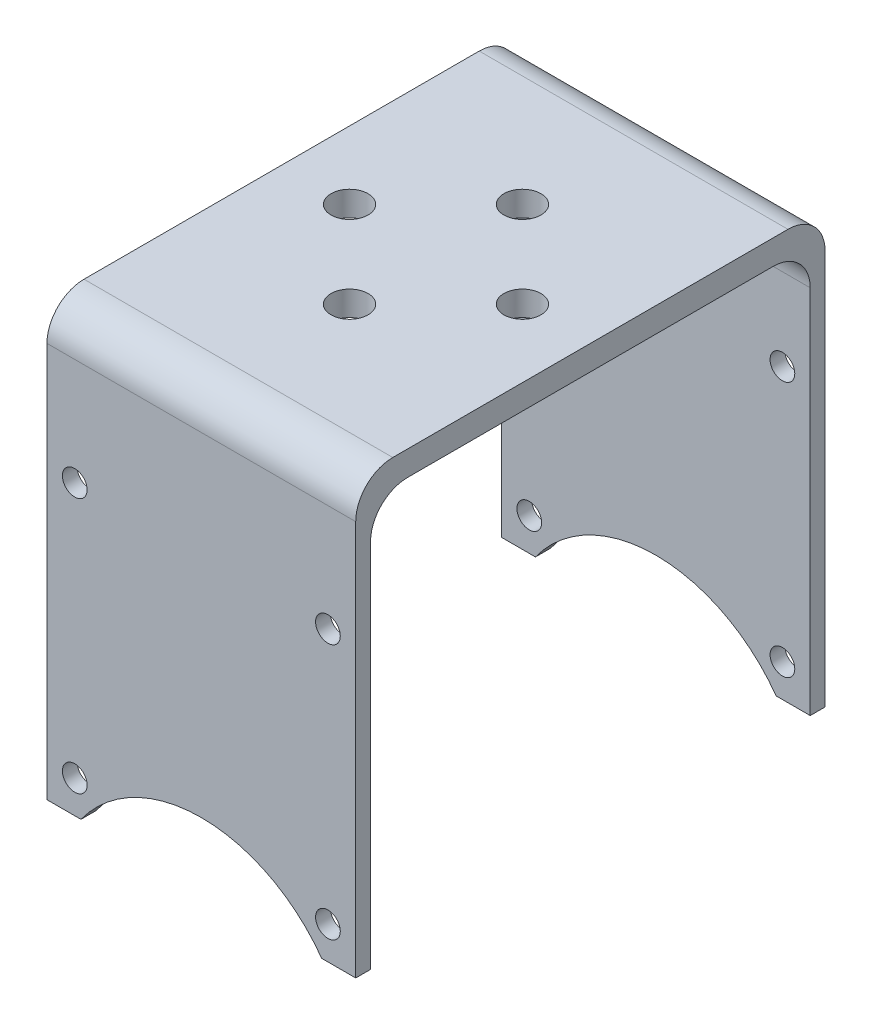
ISO-10303-21;
HEADER;
FILE_DESCRIPTION(('STEP AP214'),'2;1');
FILE_NAME('part.step','',(''),(''),'','','');
FILE_SCHEMA(('AUTOMOTIVE_DESIGN { 1 0 10303 214 1 1 1 1 }'));
ENDSEC;
DATA;
#1=APPLICATION_CONTEXT('core data for automotive mechanical design processes');
#2=APPLICATION_PROTOCOL_DEFINITION('international standard','automotive_design',2000,#1);
#3=PRODUCT_CONTEXT('',#1,'mechanical');
#4=PRODUCT('Part','Part','',(#3));
#5=PRODUCT_RELATED_PRODUCT_CATEGORY('part','',(#4));
#6=PRODUCT_DEFINITION_FORMATION('','',#4);
#7=PRODUCT_DEFINITION_CONTEXT('part definition',#1,'design');
#8=PRODUCT_DEFINITION('design','',#6,#7);
#9=PRODUCT_DEFINITION_SHAPE('','',#8);
#10=(LENGTH_UNIT() NAMED_UNIT(*) SI_UNIT(.MILLI.,.METRE.));
#11=(NAMED_UNIT(*) PLANE_ANGLE_UNIT() SI_UNIT($,.RADIAN.));
#12=(NAMED_UNIT(*) SI_UNIT($,.STERADIAN.) SOLID_ANGLE_UNIT());
#13=UNCERTAINTY_MEASURE_WITH_UNIT(LENGTH_MEASURE(1.E-05),#10,'distance_accuracy_value','');
#14=(GEOMETRIC_REPRESENTATION_CONTEXT(3) GLOBAL_UNCERTAINTY_ASSIGNED_CONTEXT((#13)) GLOBAL_UNIT_ASSIGNED_CONTEXT((#10,
#11,#12)) REPRESENTATION_CONTEXT('',''));
#15=CARTESIAN_POINT('',(0.,0.,0.));
#16=DIRECTION('',(0.,0.,1.));
#17=DIRECTION('',(1.,0.,0.));
#18=AXIS2_PLACEMENT_3D('',#15,#16,#17);
#19=CARTESIAN_POINT('',(0.,0.,0.));
#20=DIRECTION('',(0.,-1.,0.));
#21=DIRECTION('',(0.,0.,-1.));
#22=AXIS2_PLACEMENT_3D('',#19,#20,#21);
#23=PLANE('',#22);
#24=CARTESIAN_POINT('',(0.,0.,7.));
#25=DIRECTION('',(0.,-1.,0.));
#26=DIRECTION('',(0.,0.,-1.));
#27=AXIS2_PLACEMENT_3D('',#24,#25,#26);
#28=CIRCLE('',#27,1.5);
#29=CARTESIAN_POINT('',(0.,0.,5.5));
#30=VERTEX_POINT('',#29);
#31=EDGE_CURVE('E376',#30,#30,#28,.T.);
#32=ORIENTED_EDGE('',*,*,#31,.F.);
#33=EDGE_LOOP('',(#32));
#34=FACE_BOUND('',#33,.T.);
#35=CARTESIAN_POINT('',(-7.,0.,0.));
#36=DIRECTION('',(0.,-1.,0.));
#37=DIRECTION('',(0.,0.,-1.));
#38=AXIS2_PLACEMENT_3D('',#35,#36,#37);
#39=CIRCLE('',#38,1.5);
#40=CARTESIAN_POINT('',(-7.,0.,-1.50000000000002));
#41=VERTEX_POINT('',#40);
#42=EDGE_CURVE('E398',#41,#41,#39,.T.);
#43=ORIENTED_EDGE('',*,*,#42,.F.);
#44=EDGE_LOOP('',(#43));
#45=FACE_BOUND('',#44,.T.);
#46=CARTESIAN_POINT('',(0.,0.,-7.));
#47=DIRECTION('',(0.,-1.,0.));
#48=DIRECTION('',(0.,0.,-1.));
#49=AXIS2_PLACEMENT_3D('',#46,#47,#48);
#50=CIRCLE('',#49,1.5);
#51=CARTESIAN_POINT('',(0.,0.,-8.5));
#52=VERTEX_POINT('',#51);
#53=EDGE_CURVE('E402',#52,#52,#50,.T.);
#54=ORIENTED_EDGE('',*,*,#53,.F.);
#55=EDGE_LOOP('',(#54));
#56=FACE_BOUND('',#55,.T.);
#57=CARTESIAN_POINT('',(7.,0.,0.));
#58=DIRECTION('',(0.,-1.,0.));
#59=DIRECTION('',(0.,0.,-1.));
#60=AXIS2_PLACEMENT_3D('',#57,#58,#59);
#61=CIRCLE('',#60,1.5);
#62=CARTESIAN_POINT('',(7.,0.,-1.49999999999993));
#63=VERTEX_POINT('',#62);
#64=EDGE_CURVE('E406',#63,#63,#61,.T.);
#65=ORIENTED_EDGE('',*,*,#64,.F.);
#66=EDGE_LOOP('',(#65));
#67=FACE_BOUND('',#66,.T.);
#68=DIRECTION('',(0.,0.,1.));
#69=VECTOR('',#68,1.);
#70=CARTESIAN_POINT('',(-12.5,0.,10.));
#71=LINE('',#70,#69);
#72=CARTESIAN_POINT('',(-12.5,0.,-14.8));
#73=VERTEX_POINT('',#72);
#74=CARTESIAN_POINT('',(-12.5,0.,14.8));
#75=VERTEX_POINT('',#74);
#76=EDGE_CURVE('E259',#73,#75,#71,.T.);
#77=ORIENTED_EDGE('',*,*,#76,.F.);
#78=DIRECTION('',(-1.,0.,0.));
#79=VECTOR('',#78,1.);
#80=CARTESIAN_POINT('',(0.,0.,-14.8));
#81=LINE('',#80,#79);
#82=CARTESIAN_POINT('',(12.5,0.,-14.8));
#83=VERTEX_POINT('',#82);
#84=EDGE_CURVE('E283',#73,#83,#81,.F.);
#85=ORIENTED_EDGE('',*,*,#84,.T.);
#86=DIRECTION('',(0.,0.,-1.));
#87=VECTOR('',#86,1.);
#88=CARTESIAN_POINT('',(12.5,0.,-19.));
#89=LINE('',#88,#87);
#90=CARTESIAN_POINT('',(12.5,0.,14.8));
#91=VERTEX_POINT('',#90);
#92=EDGE_CURVE('E253',#91,#83,#89,.T.);
#93=ORIENTED_EDGE('',*,*,#92,.F.);
#94=DIRECTION('',(1.,0.,0.));
#95=VECTOR('',#94,1.);
#96=CARTESIAN_POINT('',(0.,0.,14.8));
#97=LINE('',#96,#95);
#98=EDGE_CURVE('E280',#91,#75,#97,.F.);
#99=ORIENTED_EDGE('',*,*,#98,.T.);
#100=EDGE_LOOP('',(#77,#85,#93,#99));
#101=FACE_BOUND('',#100,.T.);
#102=ADVANCED_FACE('F40',(#34,#45,#56,#67,#101),#23,.T.);
#103=CARTESIAN_POINT('',(0.,2.,0.));
#104=DIRECTION('',(0.,-1.,0.));
#105=DIRECTION('',(0.,0.,-1.));
#106=AXIS2_PLACEMENT_3D('',#103,#104,#105);
#107=PLANE('',#106);
#108=CARTESIAN_POINT('',(0.,2.,7.));
#109=DIRECTION('',(0.,1.,0.));
#110=DIRECTION('',(0.,0.,1.));
#111=AXIS2_PLACEMENT_3D('',#108,#109,#110);
#112=CIRCLE('',#111,1.5);
#113=CARTESIAN_POINT('',(0.,2.,8.5));
#114=VERTEX_POINT('',#113);
#115=EDGE_CURVE('E410',#114,#114,#112,.T.);
#116=ORIENTED_EDGE('',*,*,#115,.F.);
#117=EDGE_LOOP('',(#116));
#118=FACE_BOUND('',#117,.T.);
#119=CARTESIAN_POINT('',(-7.,2.,0.));
#120=DIRECTION('',(0.,1.,0.));
#121=DIRECTION('',(0.,0.,1.));
#122=AXIS2_PLACEMENT_3D('',#119,#120,#121);
#123=CIRCLE('',#122,1.5);
#124=CARTESIAN_POINT('',(-7.,2.,1.49999999999998));
#125=VERTEX_POINT('',#124);
#126=EDGE_CURVE('E419',#125,#125,#123,.T.);
#127=ORIENTED_EDGE('',*,*,#126,.F.);
#128=EDGE_LOOP('',(#127));
#129=FACE_BOUND('',#128,.T.);
#130=CARTESIAN_POINT('',(0.,2.,-7.));
#131=DIRECTION('',(0.,1.,0.));
#132=DIRECTION('',(0.,0.,1.));
#133=AXIS2_PLACEMENT_3D('',#130,#131,#132);
#134=CIRCLE('',#133,1.5);
#135=CARTESIAN_POINT('',(0.,2.,-5.5));
#136=VERTEX_POINT('',#135);
#137=EDGE_CURVE('E415',#136,#136,#134,.T.);
#138=ORIENTED_EDGE('',*,*,#137,.F.);
#139=EDGE_LOOP('',(#138));
#140=FACE_BOUND('',#139,.T.);
#141=CARTESIAN_POINT('',(7.,2.,0.));
#142=DIRECTION('',(0.,1.,0.));
#143=DIRECTION('',(0.,0.,1.));
#144=AXIS2_PLACEMENT_3D('',#141,#142,#143);
#145=CIRCLE('',#144,1.5);
#146=CARTESIAN_POINT('',(7.,2.,1.50000000000007));
#147=VERTEX_POINT('',#146);
#148=EDGE_CURVE('E411',#147,#147,#145,.T.);
#149=ORIENTED_EDGE('',*,*,#148,.F.);
#150=EDGE_LOOP('',(#149));
#151=FACE_BOUND('',#150,.T.);
#152=DIRECTION('',(-1.,0.,0.));
#153=VECTOR('',#152,1.);
#154=CARTESIAN_POINT('',(0.,2.,-16.));
#155=LINE('',#154,#153);
#156=CARTESIAN_POINT('',(12.5,2.,-16.));
#157=VERTEX_POINT('',#156);
#158=CARTESIAN_POINT('',(-12.5,2.,-16.));
#159=VERTEX_POINT('',#158);
#160=EDGE_CURVE('E290',#157,#159,#155,.T.);
#161=ORIENTED_EDGE('',*,*,#160,.T.);
#162=DIRECTION('',(0.,0.,1.));
#163=VECTOR('',#162,1.);
#164=CARTESIAN_POINT('',(-12.5,2.,10.));
#165=LINE('',#164,#163);
#166=CARTESIAN_POINT('',(-12.5,2.,16.));
#167=VERTEX_POINT('',#166);
#168=EDGE_CURVE('E258',#159,#167,#165,.T.);
#169=ORIENTED_EDGE('',*,*,#168,.T.);
#170=DIRECTION('',(1.,0.,0.));
#171=VECTOR('',#170,1.);
#172=CARTESIAN_POINT('',(0.,2.,16.));
#173=LINE('',#172,#171);
#174=CARTESIAN_POINT('',(12.5,2.,16.));
#175=VERTEX_POINT('',#174);
#176=EDGE_CURVE('E286',#167,#175,#173,.T.);
#177=ORIENTED_EDGE('',*,*,#176,.T.);
#178=DIRECTION('',(0.,0.,-1.));
#179=VECTOR('',#178,1.);
#180=CARTESIAN_POINT('',(12.5,2.,-19.));
#181=LINE('',#180,#179);
#182=EDGE_CURVE('E254',#175,#157,#181,.T.);
#183=ORIENTED_EDGE('',*,*,#182,.T.);
#184=EDGE_LOOP('',(#161,#169,#177,#183));
#185=FACE_BOUND('',#184,.T.);
#186=ADVANCED_FACE('F429',(#118,#129,#140,#151,#185),#107,.F.);
#187=CARTESIAN_POINT('',(-12.5,2.,-19.));
#188=DIRECTION('',(0.,0.,1.));
#189=DIRECTION('',(1.,0.,0.));
#190=AXIS2_PLACEMENT_3D('',#187,#188,#189);
#191=PLANE('',#190);
#192=DIRECTION('',(0.,-1.,0.));
#193=VECTOR('',#192,1.);
#194=CARTESIAN_POINT('',(12.5,2.,-19.));
#195=LINE('',#194,#193);
#196=CARTESIAN_POINT('',(12.5,-1.,-19.));
#197=VERTEX_POINT('',#196);
#198=CARTESIAN_POINT('',(12.5,-33.,-19.));
#199=VERTEX_POINT('',#198);
#200=EDGE_CURVE('E156',#197,#199,#195,.T.);
#201=ORIENTED_EDGE('',*,*,#200,.T.);
#202=DIRECTION('',(-1.,0.,0.));
#203=VECTOR('',#202,1.);
#204=CARTESIAN_POINT('',(9.74679434480896,-33.,-19.));
#205=LINE('',#204,#203);
#206=CARTESIAN_POINT('',(9.74679434480896,-33.,-19.));
#207=VERTEX_POINT('',#206);
#208=EDGE_CURVE('E160',#199,#207,#205,.T.);
#209=ORIENTED_EDGE('',*,*,#208,.T.);
#210=CARTESIAN_POINT('',(0.,-40.,-19.));
#211=DIRECTION('',(0.,0.,1.));
#212=DIRECTION('',(-1.,0.,0.));
#213=AXIS2_PLACEMENT_3D('',#210,#211,#212);
#214=CIRCLE('',#213,12.);
#215=CARTESIAN_POINT('',(-9.74679434480896,-33.,-19.));
#216=VERTEX_POINT('',#215);
#217=EDGE_CURVE('E175',#207,#216,#214,.T.);
#218=ORIENTED_EDGE('',*,*,#217,.T.);
#219=DIRECTION('',(-1.,0.,0.));
#220=VECTOR('',#219,1.);
#221=CARTESIAN_POINT('',(-12.5,-33.,-19.));
#222=LINE('',#221,#220);
#223=CARTESIAN_POINT('',(-12.5,-33.,-19.));
#224=VERTEX_POINT('',#223);
#225=EDGE_CURVE('E189',#216,#224,#222,.T.);
#226=ORIENTED_EDGE('',*,*,#225,.T.);
#227=DIRECTION('',(0.,-1.,0.));
#228=VECTOR('',#227,1.);
#229=CARTESIAN_POINT('',(-12.5,2.,-19.));
#230=LINE('',#229,#228);
#231=CARTESIAN_POINT('',(-12.5,-1.,-19.));
#232=VERTEX_POINT('',#231);
#233=EDGE_CURVE('E168',#232,#224,#230,.T.);
#234=ORIENTED_EDGE('',*,*,#233,.F.);
#235=DIRECTION('',(-1.,0.,0.));
#236=VECTOR('',#235,1.);
#237=CARTESIAN_POINT('',(-12.5,-1.,-19.));
#238=LINE('',#237,#236);
#239=EDGE_CURVE('E163',#232,#197,#238,.F.);
#240=ORIENTED_EDGE('',*,*,#239,.T.);
#241=EDGE_LOOP('',(#201,#209,#218,#226,#234,#240));
#242=FACE_BOUND('',#241,.T.);
#243=CARTESIAN_POINT('',(-10.25,-30.35,-19.));
#244=DIRECTION('',(0.,0.,1.));
#245=DIRECTION('',(1.,0.,0.));
#246=AXIS2_PLACEMENT_3D('',#243,#244,#245);
#247=CIRCLE('',#246,1.);
#248=CARTESIAN_POINT('',(-9.25,-30.35,-19.));
#249=VERTEX_POINT('',#248);
#250=EDGE_CURVE('E202',#249,#249,#247,.T.);
#251=ORIENTED_EDGE('',*,*,#250,.T.);
#252=EDGE_LOOP('',(#251));
#253=FACE_BOUND('',#252,.T.);
#254=CARTESIAN_POINT('',(-10.25,-9.65,-19.));
#255=DIRECTION('',(0.,0.,1.));
#256=DIRECTION('',(1.,0.,0.));
#257=AXIS2_PLACEMENT_3D('',#254,#255,#256);
#258=CIRCLE('',#257,1.);
#259=CARTESIAN_POINT('',(-9.25,-9.65,-19.));
#260=VERTEX_POINT('',#259);
#261=EDGE_CURVE('E211',#260,#260,#258,.T.);
#262=ORIENTED_EDGE('',*,*,#261,.T.);
#263=EDGE_LOOP('',(#262));
#264=FACE_BOUND('',#263,.T.);
#265=CARTESIAN_POINT('',(10.25,-9.65,-19.));
#266=DIRECTION('',(0.,0.,1.));
#267=DIRECTION('',(1.,0.,0.));
#268=AXIS2_PLACEMENT_3D('',#265,#266,#267);
#269=CIRCLE('',#268,1.);
#270=CARTESIAN_POINT('',(11.25,-9.65,-19.));
#271=VERTEX_POINT('',#270);
#272=EDGE_CURVE('E384',#271,#271,#269,.T.);
#273=ORIENTED_EDGE('',*,*,#272,.T.);
#274=EDGE_LOOP('',(#273));
#275=FACE_BOUND('',#274,.T.);
#276=CARTESIAN_POINT('',(10.25,-30.35,-19.));
#277=DIRECTION('',(0.,0.,1.));
#278=DIRECTION('',(1.,0.,0.));
#279=AXIS2_PLACEMENT_3D('',#276,#277,#278);
#280=CIRCLE('',#279,1.);
#281=CARTESIAN_POINT('',(11.25,-30.35,-19.));
#282=VERTEX_POINT('',#281);
#283=EDGE_CURVE('E192',#282,#282,#280,.T.);
#284=ORIENTED_EDGE('',*,*,#283,.T.);
#285=EDGE_LOOP('',(#284));
#286=FACE_BOUND('',#285,.T.);
#287=ADVANCED_FACE('F157',(#242,#253,#264,#275,#286),#191,.F.);
#288=CARTESIAN_POINT('',(-12.5,2.,10.));
#289=DIRECTION('',(1.,0.,0.));
#290=DIRECTION('',(0.,0.,-1.));
#291=AXIS2_PLACEMENT_3D('',#288,#289,#290);
#292=PLANE('',#291);
#293=CARTESIAN_POINT('',(-12.5,-3.,14.8));
#294=DIRECTION('',(1.,0.,0.));
#295=DIRECTION('',(0.,0.,-1.));
#296=AXIS2_PLACEMENT_3D('',#293,#294,#295);
#297=CIRCLE('',#296,3.);
#298=CARTESIAN_POINT('',(-12.5,-3.,17.8));
#299=VERTEX_POINT('',#298);
#300=EDGE_CURVE('E326',#75,#299,#297,.T.);
#301=ORIENTED_EDGE('',*,*,#300,.T.);
#302=DIRECTION('',(0.,1.,0.));
#303=VECTOR('',#302,1.);
#304=CARTESIAN_POINT('',(-12.5,-40.,17.8));
#305=LINE('',#304,#303);
#306=CARTESIAN_POINT('',(-12.5,-33.,17.8));
#307=VERTEX_POINT('',#306);
#308=EDGE_CURVE('E250',#307,#299,#305,.T.);
#309=ORIENTED_EDGE('',*,*,#308,.F.);
#310=DIRECTION('',(0.,0.,1.));
#311=VECTOR('',#310,1.);
#312=CARTESIAN_POINT('',(-12.5,-33.,-19.));
#313=LINE('',#312,#311);
#314=CARTESIAN_POINT('',(-12.5,-33.,19.));
#315=VERTEX_POINT('',#314);
#316=EDGE_CURVE('E358',#307,#315,#313,.T.);
#317=ORIENTED_EDGE('',*,*,#316,.T.);
#318=DIRECTION('',(0.,-1.,0.));
#319=VECTOR('',#318,1.);
#320=CARTESIAN_POINT('',(-12.5,2.,19.));
#321=LINE('',#320,#319);
#322=CARTESIAN_POINT('',(-12.5,-1.,19.));
#323=VERTEX_POINT('',#322);
#324=EDGE_CURVE('E272',#323,#315,#321,.T.);
#325=ORIENTED_EDGE('',*,*,#324,.F.);
#326=CARTESIAN_POINT('',(-12.5,-1.,16.));
#327=DIRECTION('',(1.,0.,0.));
#328=DIRECTION('',(0.,0.,-1.));
#329=AXIS2_PLACEMENT_3D('',#326,#327,#328);
#330=CIRCLE('',#329,3.);
#331=EDGE_CURVE('E308',#323,#167,#330,.F.);
#332=ORIENTED_EDGE('',*,*,#331,.T.);
#333=ORIENTED_EDGE('',*,*,#168,.F.);
#334=CARTESIAN_POINT('',(-12.5,-1.,-16.));
#335=DIRECTION('',(1.,0.,0.));
#336=DIRECTION('',(0.,0.,-1.));
#337=AXIS2_PLACEMENT_3D('',#334,#335,#336);
#338=CIRCLE('',#337,3.);
#339=EDGE_CURVE('E294',#159,#232,#338,.F.);
#340=ORIENTED_EDGE('',*,*,#339,.T.);
#341=ORIENTED_EDGE('',*,*,#233,.T.);
#342=CARTESIAN_POINT('',(-12.5,-33.,-17.8));
#343=VERTEX_POINT('',#342);
#344=EDGE_CURVE('E201',#224,#343,#313,.T.);
#345=ORIENTED_EDGE('',*,*,#344,.T.);
#346=DIRECTION('',(0.,1.,0.));
#347=VECTOR('',#346,1.);
#348=CARTESIAN_POINT('',(-12.5,-40.,-17.8));
#349=LINE('',#348,#347);
#350=CARTESIAN_POINT('',(-12.5,-3.,-17.8));
#351=VERTEX_POINT('',#350);
#352=EDGE_CURVE('E242',#343,#351,#349,.T.);
#353=ORIENTED_EDGE('',*,*,#352,.T.);
#354=CARTESIAN_POINT('',(-12.5,-3.,-14.8));
#355=DIRECTION('',(1.,0.,0.));
#356=DIRECTION('',(0.,0.,-1.));
#357=AXIS2_PLACEMENT_3D('',#354,#355,#356);
#358=CIRCLE('',#357,3.);
#359=EDGE_CURVE('E315',#351,#73,#358,.T.);
#360=ORIENTED_EDGE('',*,*,#359,.T.);
#361=ORIENTED_EDGE('',*,*,#76,.T.);
#362=EDGE_LOOP('',(#301,#309,#317,#325,#332,#333,#340,#341,#345,#353,#360,#361));
#363=FACE_BOUND('',#362,.T.);
#364=ADVANCED_FACE('F445',(#363),#292,.F.);
#365=CARTESIAN_POINT('',(-12.5,2.,19.));
#366=DIRECTION('',(0.,0.,-1.));
#367=DIRECTION('',(-1.,0.,0.));
#368=AXIS2_PLACEMENT_3D('',#365,#366,#367);
#369=PLANE('',#368);
#370=ORIENTED_EDGE('',*,*,#324,.T.);
#371=DIRECTION('',(-1.,0.,0.));
#372=VECTOR('',#371,1.);
#373=CARTESIAN_POINT('',(-12.5,-33.,19.));
#374=LINE('',#373,#372);
#375=CARTESIAN_POINT('',(-9.74679434480896,-33.,19.));
#376=VERTEX_POINT('',#375);
#377=EDGE_CURVE('E176',#376,#315,#374,.T.);
#378=ORIENTED_EDGE('',*,*,#377,.F.);
#379=CARTESIAN_POINT('',(0.,-40.,19.));
#380=DIRECTION('',(0.,0.,1.));
#381=DIRECTION('',(-1.,0.,0.));
#382=AXIS2_PLACEMENT_3D('',#379,#380,#381);
#383=CIRCLE('',#382,12.);
#384=CARTESIAN_POINT('',(9.74679434480896,-33.,19.));
#385=VERTEX_POINT('',#384);
#386=EDGE_CURVE('E369',#385,#376,#383,.T.);
#387=ORIENTED_EDGE('',*,*,#386,.F.);
#388=DIRECTION('',(-1.,0.,0.));
#389=VECTOR('',#388,1.);
#390=CARTESIAN_POINT('',(9.74679434480896,-33.,19.));
#391=LINE('',#390,#389);
#392=CARTESIAN_POINT('',(12.5,-33.,19.));
#393=VERTEX_POINT('',#392);
#394=EDGE_CURVE('E373',#393,#385,#391,.T.);
#395=ORIENTED_EDGE('',*,*,#394,.F.);
#396=DIRECTION('',(0.,-1.,0.));
#397=VECTOR('',#396,1.);
#398=CARTESIAN_POINT('',(12.5,2.,19.));
#399=LINE('',#398,#397);
#400=CARTESIAN_POINT('',(12.5,-1.,19.));
#401=VERTEX_POINT('',#400);
#402=EDGE_CURVE('E263',#401,#393,#399,.T.);
#403=ORIENTED_EDGE('',*,*,#402,.F.);
#404=DIRECTION('',(1.,0.,0.));
#405=VECTOR('',#404,1.);
#406=CARTESIAN_POINT('',(-12.5,-1.,19.));
#407=LINE('',#406,#405);
#408=EDGE_CURVE('E305',#401,#323,#407,.F.);
#409=ORIENTED_EDGE('',*,*,#408,.T.);
#410=EDGE_LOOP('',(#370,#378,#387,#395,#403,#409));
#411=FACE_BOUND('',#410,.T.);
#412=CARTESIAN_POINT('',(-10.25,-30.35,19.));
#413=DIRECTION('',(0.,0.,1.));
#414=DIRECTION('',(1.,0.,0.));
#415=AXIS2_PLACEMENT_3D('',#412,#413,#414);
#416=CIRCLE('',#415,1.);
#417=CARTESIAN_POINT('',(-9.25,-30.35,19.));
#418=VERTEX_POINT('',#417);
#419=EDGE_CURVE('E207',#418,#418,#416,.T.);
#420=ORIENTED_EDGE('',*,*,#419,.F.);
#421=EDGE_LOOP('',(#420));
#422=FACE_BOUND('',#421,.T.);
#423=CARTESIAN_POINT('',(-10.25,-9.65,19.));
#424=DIRECTION('',(0.,0.,1.));
#425=DIRECTION('',(1.,0.,0.));
#426=AXIS2_PLACEMENT_3D('',#423,#424,#425);
#427=CIRCLE('',#426,1.);
#428=CARTESIAN_POINT('',(-9.25,-9.65,19.));
#429=VERTEX_POINT('',#428);
#430=EDGE_CURVE('E388',#429,#429,#427,.T.);
#431=ORIENTED_EDGE('',*,*,#430,.F.);
#432=EDGE_LOOP('',(#431));
#433=FACE_BOUND('',#432,.T.);
#434=CARTESIAN_POINT('',(10.25,-9.65,19.));
#435=DIRECTION('',(0.,0.,1.));
#436=DIRECTION('',(1.,0.,0.));
#437=AXIS2_PLACEMENT_3D('',#434,#435,#436);
#438=CIRCLE('',#437,1.);
#439=CARTESIAN_POINT('',(11.25,-9.65,19.));
#440=VERTEX_POINT('',#439);
#441=EDGE_CURVE('E196',#440,#440,#438,.T.);
#442=ORIENTED_EDGE('',*,*,#441,.F.);
#443=EDGE_LOOP('',(#442));
#444=FACE_BOUND('',#443,.T.);
#445=CARTESIAN_POINT('',(10.25,-30.35,19.));
#446=DIRECTION('',(0.,0.,1.));
#447=DIRECTION('',(1.,0.,0.));
#448=AXIS2_PLACEMENT_3D('',#445,#446,#447);
#449=CIRCLE('',#448,1.);
#450=CARTESIAN_POINT('',(11.25,-30.35,19.));
#451=VERTEX_POINT('',#450);
#452=EDGE_CURVE('E197',#451,#451,#449,.T.);
#453=ORIENTED_EDGE('',*,*,#452,.F.);
#454=EDGE_LOOP('',(#453));
#455=FACE_BOUND('',#454,.T.);
#456=ADVANCED_FACE('F456',(#411,#422,#433,#444,#455),#369,.F.);
#457=CARTESIAN_POINT('',(12.5,2.,10.));
#458=DIRECTION('',(-1.,0.,0.));
#459=DIRECTION('',(0.,0.,1.));
#460=AXIS2_PLACEMENT_3D('',#457,#458,#459);
#461=PLANE('',#460);
#462=ORIENTED_EDGE('',*,*,#402,.T.);
#463=DIRECTION('',(0.,0.,1.));
#464=VECTOR('',#463,1.);
#465=CARTESIAN_POINT('',(12.5,-33.,-19.));
#466=LINE('',#465,#464);
#467=CARTESIAN_POINT('',(12.5,-33.,17.8));
#468=VERTEX_POINT('',#467);
#469=EDGE_CURVE('E183',#468,#393,#466,.T.);
#470=ORIENTED_EDGE('',*,*,#469,.F.);
#471=DIRECTION('',(0.,1.,0.));
#472=VECTOR('',#471,1.);
#473=CARTESIAN_POINT('',(12.5,-40.,17.8));
#474=LINE('',#473,#472);
#475=CARTESIAN_POINT('',(12.5,-3.,17.8));
#476=VERTEX_POINT('',#475);
#477=EDGE_CURVE('E247',#468,#476,#474,.T.);
#478=ORIENTED_EDGE('',*,*,#477,.T.);
#479=CARTESIAN_POINT('',(12.5,-3.,14.8));
#480=DIRECTION('',(-1.,0.,0.));
#481=DIRECTION('',(0.,0.,1.));
#482=AXIS2_PLACEMENT_3D('',#479,#480,#481);
#483=CIRCLE('',#482,3.);
#484=EDGE_CURVE('E322',#476,#91,#483,.T.);
#485=ORIENTED_EDGE('',*,*,#484,.T.);
#486=ORIENTED_EDGE('',*,*,#92,.T.);
#487=CARTESIAN_POINT('',(12.5,-3.,-14.8));
#488=DIRECTION('',(-1.,0.,0.));
#489=DIRECTION('',(0.,0.,1.));
#490=AXIS2_PLACEMENT_3D('',#487,#488,#489);
#491=CIRCLE('',#490,3.);
#492=CARTESIAN_POINT('',(12.5,-3.,-17.8));
#493=VERTEX_POINT('',#492);
#494=EDGE_CURVE('E319',#83,#493,#491,.T.);
#495=ORIENTED_EDGE('',*,*,#494,.T.);
#496=DIRECTION('',(0.,1.,0.));
#497=VECTOR('',#496,1.);
#498=CARTESIAN_POINT('',(12.5,-40.,-17.8));
#499=LINE('',#498,#497);
#500=CARTESIAN_POINT('',(12.5,-33.,-17.8));
#501=VERTEX_POINT('',#500);
#502=EDGE_CURVE('E181',#501,#493,#499,.T.);
#503=ORIENTED_EDGE('',*,*,#502,.F.);
#504=EDGE_CURVE('E65',#199,#501,#466,.T.);
#505=ORIENTED_EDGE('',*,*,#504,.F.);
#506=ORIENTED_EDGE('',*,*,#200,.F.);
#507=CARTESIAN_POINT('',(12.5,-1.,-16.));
#508=DIRECTION('',(-1.,0.,0.));
#509=DIRECTION('',(0.,0.,1.));
#510=AXIS2_PLACEMENT_3D('',#507,#508,#509);
#511=CIRCLE('',#510,3.);
#512=EDGE_CURVE('E299',#197,#157,#511,.F.);
#513=ORIENTED_EDGE('',*,*,#512,.T.);
#514=ORIENTED_EDGE('',*,*,#182,.F.);
#515=CARTESIAN_POINT('',(12.5,-1.,16.));
#516=DIRECTION('',(-1.,0.,0.));
#517=DIRECTION('',(0.,0.,1.));
#518=AXIS2_PLACEMENT_3D('',#515,#516,#517);
#519=CIRCLE('',#518,3.);
#520=EDGE_CURVE('E302',#175,#401,#519,.F.);
#521=ORIENTED_EDGE('',*,*,#520,.T.);
#522=EDGE_LOOP('',(#462,#470,#478,#485,#486,#495,#503,#505,#506,#513,#514,#521));
#523=FACE_BOUND('',#522,.T.);
#524=ADVANCED_FACE('F179',(#523),#461,.F.);
#525=CARTESIAN_POINT('',(-12.5,-40.,17.8));
#526=DIRECTION('',(0.,0.,1.));
#527=DIRECTION('',(1.,0.,0.));
#528=AXIS2_PLACEMENT_3D('',#525,#526,#527);
#529=PLANE('',#528);
#530=CARTESIAN_POINT('',(10.25,-30.35,17.8));
#531=DIRECTION('',(0.,0.,1.));
#532=DIRECTION('',(1.,0.,0.));
#533=AXIS2_PLACEMENT_3D('',#530,#531,#532);
#534=CIRCLE('',#533,1.);
#535=CARTESIAN_POINT('',(11.25,-30.35,17.8));
#536=VERTEX_POINT('',#535);
#537=EDGE_CURVE('E238',#536,#536,#534,.T.);
#538=ORIENTED_EDGE('',*,*,#537,.T.);
#539=EDGE_LOOP('',(#538));
#540=FACE_BOUND('',#539,.T.);
#541=CARTESIAN_POINT('',(10.25,-9.65,17.8));
#542=DIRECTION('',(0.,0.,1.));
#543=DIRECTION('',(1.,0.,0.));
#544=AXIS2_PLACEMENT_3D('',#541,#542,#543);
#545=CIRCLE('',#544,1.);
#546=CARTESIAN_POINT('',(11.25,-9.65,17.8));
#547=VERTEX_POINT('',#546);
#548=EDGE_CURVE('E222',#547,#547,#545,.T.);
#549=ORIENTED_EDGE('',*,*,#548,.T.);
#550=EDGE_LOOP('',(#549));
#551=FACE_BOUND('',#550,.T.);
#552=CARTESIAN_POINT('',(-10.25,-9.65,17.8));
#553=DIRECTION('',(0.,0.,1.));
#554=DIRECTION('',(1.,0.,0.));
#555=AXIS2_PLACEMENT_3D('',#552,#553,#554);
#556=CIRCLE('',#555,1.);
#557=CARTESIAN_POINT('',(-9.25,-9.65,17.8));
#558=VERTEX_POINT('',#557);
#559=EDGE_CURVE('E217',#558,#558,#556,.T.);
#560=ORIENTED_EDGE('',*,*,#559,.T.);
#561=EDGE_LOOP('',(#560));
#562=FACE_BOUND('',#561,.T.);
#563=CARTESIAN_POINT('',(-10.25,-30.35,17.8));
#564=DIRECTION('',(0.,0.,1.));
#565=DIRECTION('',(1.,0.,0.));
#566=AXIS2_PLACEMENT_3D('',#563,#564,#565);
#567=CIRCLE('',#566,1.);
#568=CARTESIAN_POINT('',(-9.25,-30.35,17.8));
#569=VERTEX_POINT('',#568);
#570=EDGE_CURVE('E212',#569,#569,#567,.T.);
#571=ORIENTED_EDGE('',*,*,#570,.T.);
#572=EDGE_LOOP('',(#571));
#573=FACE_BOUND('',#572,.T.);
#574=CARTESIAN_POINT('',(0.,-40.,17.8));
#575=DIRECTION('',(0.,0.,1.));
#576=DIRECTION('',(1.,0.,0.));
#577=AXIS2_PLACEMENT_3D('',#574,#575,#576);
#578=CIRCLE('',#577,12.);
#579=CARTESIAN_POINT('',(9.74679434480897,-33.,17.8));
#580=VERTEX_POINT('',#579);
#581=CARTESIAN_POINT('',(-9.74679434480896,-33.,17.8));
#582=VERTEX_POINT('',#581);
#583=EDGE_CURVE('E230',#580,#582,#578,.T.);
#584=ORIENTED_EDGE('',*,*,#583,.T.);
#585=DIRECTION('',(-1.,0.,0.));
#586=VECTOR('',#585,1.);
#587=CARTESIAN_POINT('',(-12.5,-33.,17.8));
#588=LINE('',#587,#586);
#589=EDGE_CURVE('E234',#582,#307,#588,.T.);
#590=ORIENTED_EDGE('',*,*,#589,.T.);
#591=ORIENTED_EDGE('',*,*,#308,.T.);
#592=DIRECTION('',(1.,0.,0.));
#593=VECTOR('',#592,1.);
#594=CARTESIAN_POINT('',(-12.5,-3.,17.8));
#595=LINE('',#594,#593);
#596=EDGE_CURVE('E311',#299,#476,#595,.T.);
#597=ORIENTED_EDGE('',*,*,#596,.T.);
#598=ORIENTED_EDGE('',*,*,#477,.F.);
#599=DIRECTION('',(-1.,0.,0.));
#600=VECTOR('',#599,1.);
#601=CARTESIAN_POINT('',(-12.5,-33.,17.8));
#602=LINE('',#601,#600);
#603=EDGE_CURVE('E226',#468,#580,#602,.T.);
#604=ORIENTED_EDGE('',*,*,#603,.T.);
#605=EDGE_LOOP('',(#584,#590,#591,#597,#598,#604));
#606=FACE_BOUND('',#605,.T.);
#607=ADVANCED_FACE('F464',(#540,#551,#562,#573,#606),#529,.F.);
#608=CARTESIAN_POINT('',(12.5,-40.,-17.8));
#609=DIRECTION('',(0.,0.,-1.));
#610=DIRECTION('',(-1.,0.,0.));
#611=AXIS2_PLACEMENT_3D('',#608,#609,#610);
#612=PLANE('',#611);
#613=CARTESIAN_POINT('',(10.25,-30.35,-17.8));
#614=DIRECTION('',(0.,0.,-1.));
#615=DIRECTION('',(-1.,0.,0.));
#616=AXIS2_PLACEMENT_3D('',#613,#614,#615);
#617=CIRCLE('',#616,1.);
#618=CARTESIAN_POINT('',(9.25,-30.35,-17.8));
#619=VERTEX_POINT('',#618);
#620=EDGE_CURVE('E44',#619,#619,#617,.T.);
#621=ORIENTED_EDGE('',*,*,#620,.T.);
#622=EDGE_LOOP('',(#621));
#623=FACE_BOUND('',#622,.T.);
#624=CARTESIAN_POINT('',(10.25,-9.65,-17.8));
#625=DIRECTION('',(0.,0.,-1.));
#626=DIRECTION('',(-1.,0.,0.));
#627=AXIS2_PLACEMENT_3D('',#624,#625,#626);
#628=CIRCLE('',#627,1.);
#629=CARTESIAN_POINT('',(9.25,-9.65,-17.8));
#630=VERTEX_POINT('',#629);
#631=EDGE_CURVE('E221',#630,#630,#628,.T.);
#632=ORIENTED_EDGE('',*,*,#631,.T.);
#633=EDGE_LOOP('',(#632));
#634=FACE_BOUND('',#633,.T.);
#635=CARTESIAN_POINT('',(-10.25,-9.65,-17.8));
#636=DIRECTION('',(0.,0.,-1.));
#637=DIRECTION('',(-1.,0.,0.));
#638=AXIS2_PLACEMENT_3D('',#635,#636,#637);
#639=CIRCLE('',#638,1.);
#640=CARTESIAN_POINT('',(-11.25,-9.65,-17.8));
#641=VERTEX_POINT('',#640);
#642=EDGE_CURVE('E216',#641,#641,#639,.T.);
#643=ORIENTED_EDGE('',*,*,#642,.T.);
#644=EDGE_LOOP('',(#643));
#645=FACE_BOUND('',#644,.T.);
#646=CARTESIAN_POINT('',(-10.25,-30.35,-17.8));
#647=DIRECTION('',(0.,0.,-1.));
#648=DIRECTION('',(-1.,0.,0.));
#649=AXIS2_PLACEMENT_3D('',#646,#647,#648);
#650=CIRCLE('',#649,1.);
#651=CARTESIAN_POINT('',(-11.25,-30.35,-17.8));
#652=VERTEX_POINT('',#651);
#653=EDGE_CURVE('E206',#652,#652,#650,.T.);
#654=ORIENTED_EDGE('',*,*,#653,.T.);
#655=EDGE_LOOP('',(#654));
#656=FACE_BOUND('',#655,.T.);
#657=ORIENTED_EDGE('',*,*,#352,.F.);
#658=DIRECTION('',(1.,0.,0.));
#659=VECTOR('',#658,1.);
#660=CARTESIAN_POINT('',(12.5,-33.,-17.8));
#661=LINE('',#660,#659);
#662=CARTESIAN_POINT('',(-9.74679434480896,-33.,-17.8));
#663=VERTEX_POINT('',#662);
#664=EDGE_CURVE('E12',#343,#663,#661,.T.);
#665=ORIENTED_EDGE('',*,*,#664,.T.);
#666=CARTESIAN_POINT('',(0.,-40.,-17.8));
#667=DIRECTION('',(0.,0.,-1.));
#668=DIRECTION('',(-1.,0.,0.));
#669=AXIS2_PLACEMENT_3D('',#666,#667,#668);
#670=CIRCLE('',#669,12.);
#671=CARTESIAN_POINT('',(9.74679434480896,-33.,-17.8));
#672=VERTEX_POINT('',#671);
#673=EDGE_CURVE('E50',#663,#672,#670,.T.);
#674=ORIENTED_EDGE('',*,*,#673,.T.);
#675=DIRECTION('',(1.,0.,0.));
#676=VECTOR('',#675,1.);
#677=CARTESIAN_POINT('',(12.5,-33.,-17.8));
#678=LINE('',#677,#676);
#679=EDGE_CURVE('E330',#672,#501,#678,.T.);
#680=ORIENTED_EDGE('',*,*,#679,.T.);
#681=ORIENTED_EDGE('',*,*,#502,.T.);
#682=DIRECTION('',(-1.,0.,0.));
#683=VECTOR('',#682,1.);
#684=CARTESIAN_POINT('',(12.5,-3.,-17.8));
#685=LINE('',#684,#683);
#686=EDGE_CURVE('E167',#493,#351,#685,.T.);
#687=ORIENTED_EDGE('',*,*,#686,.T.);
#688=EDGE_LOOP('',(#657,#665,#674,#680,#681,#687));
#689=FACE_BOUND('',#688,.T.);
#690=ADVANCED_FACE('F346',(#623,#634,#645,#656,#689),#612,.F.);
#691=CARTESIAN_POINT('',(12.5,-3.,-14.8));
#692=DIRECTION('',(-1.,0.,0.));
#693=DIRECTION('',(0.,0.,1.));
#694=AXIS2_PLACEMENT_3D('',#691,#692,#693);
#695=CYLINDRICAL_SURFACE('',#694,3.);
#696=ORIENTED_EDGE('',*,*,#494,.F.);
#697=ORIENTED_EDGE('',*,*,#84,.F.);
#698=ORIENTED_EDGE('',*,*,#359,.F.);
#699=ORIENTED_EDGE('',*,*,#686,.F.);
#700=EDGE_LOOP('',(#696,#697,#698,#699));
#701=FACE_BOUND('',#700,.T.);
#702=ADVANCED_FACE('F475',(#701),#695,.F.);
#703=CARTESIAN_POINT('',(0.,-1.,-16.));
#704=DIRECTION('',(-1.,0.,0.));
#705=DIRECTION('',(0.,0.,1.));
#706=AXIS2_PLACEMENT_3D('',#703,#704,#705);
#707=CYLINDRICAL_SURFACE('',#706,3.);
#708=ORIENTED_EDGE('',*,*,#512,.F.);
#709=ORIENTED_EDGE('',*,*,#239,.F.);
#710=ORIENTED_EDGE('',*,*,#339,.F.);
#711=ORIENTED_EDGE('',*,*,#160,.F.);
#712=EDGE_LOOP('',(#708,#709,#710,#711));
#713=FACE_BOUND('',#712,.T.);
#714=ADVANCED_FACE('F443',(#713),#707,.T.);
#715=CARTESIAN_POINT('',(0.,-1.,16.));
#716=DIRECTION('',(1.,0.,0.));
#717=DIRECTION('',(0.,0.,-1.));
#718=AXIS2_PLACEMENT_3D('',#715,#716,#717);
#719=CYLINDRICAL_SURFACE('',#718,3.);
#720=ORIENTED_EDGE('',*,*,#331,.F.);
#721=ORIENTED_EDGE('',*,*,#408,.F.);
#722=ORIENTED_EDGE('',*,*,#520,.F.);
#723=ORIENTED_EDGE('',*,*,#176,.F.);
#724=EDGE_LOOP('',(#720,#721,#722,#723));
#725=FACE_BOUND('',#724,.T.);
#726=ADVANCED_FACE('F450',(#725),#719,.T.);
#727=CARTESIAN_POINT('',(-12.5,-3.,14.8));
#728=DIRECTION('',(1.,0.,0.));
#729=DIRECTION('',(0.,0.,-1.));
#730=AXIS2_PLACEMENT_3D('',#727,#728,#729);
#731=CYLINDRICAL_SURFACE('',#730,3.);
#732=ORIENTED_EDGE('',*,*,#300,.F.);
#733=ORIENTED_EDGE('',*,*,#98,.F.);
#734=ORIENTED_EDGE('',*,*,#484,.F.);
#735=ORIENTED_EDGE('',*,*,#596,.F.);
#736=EDGE_LOOP('',(#732,#733,#734,#735));
#737=FACE_BOUND('',#736,.T.);
#738=ADVANCED_FACE('F42',(#737),#731,.F.);
#739=CARTESIAN_POINT('',(-10.25,-30.35,-19.));
#740=DIRECTION('',(0.,0.,1.));
#741=DIRECTION('',(1.,0.,0.));
#742=AXIS2_PLACEMENT_3D('',#739,#740,#741);
#743=CYLINDRICAL_SURFACE('',#742,1.);
#744=ORIENTED_EDGE('',*,*,#250,.F.);
#745=EDGE_LOOP('',(#744));
#746=FACE_BOUND('',#745,.T.);
#747=ORIENTED_EDGE('',*,*,#653,.F.);
#748=EDGE_LOOP('',(#747));
#749=FACE_BOUND('',#748,.T.);
#750=ADVANCED_FACE('F501',(#746,#749),#743,.F.);
#751=CARTESIAN_POINT('',(-10.25,-9.65,-19.));
#752=DIRECTION('',(0.,0.,1.));
#753=DIRECTION('',(1.,0.,0.));
#754=AXIS2_PLACEMENT_3D('',#751,#752,#753);
#755=CYLINDRICAL_SURFACE('',#754,1.);
#756=ORIENTED_EDGE('',*,*,#261,.F.);
#757=EDGE_LOOP('',(#756));
#758=FACE_BOUND('',#757,.T.);
#759=ORIENTED_EDGE('',*,*,#642,.F.);
#760=EDGE_LOOP('',(#759));
#761=FACE_BOUND('',#760,.T.);
#762=ADVANCED_FACE('F505',(#758,#761),#755,.F.);
#763=CARTESIAN_POINT('',(10.25,-9.65,-19.));
#764=DIRECTION('',(0.,0.,1.));
#765=DIRECTION('',(1.,0.,0.));
#766=AXIS2_PLACEMENT_3D('',#763,#764,#765);
#767=CYLINDRICAL_SURFACE('',#766,1.);
#768=ORIENTED_EDGE('',*,*,#272,.F.);
#769=EDGE_LOOP('',(#768));
#770=FACE_BOUND('',#769,.T.);
#771=ORIENTED_EDGE('',*,*,#631,.F.);
#772=EDGE_LOOP('',(#771));
#773=FACE_BOUND('',#772,.T.);
#774=ADVANCED_FACE('F512',(#770,#773),#767,.F.);
#775=CARTESIAN_POINT('',(9.74679434480896,-33.,-19.));
#776=DIRECTION('',(0.,1.,0.));
#777=DIRECTION('',(0.,0.,1.));
#778=AXIS2_PLACEMENT_3D('',#775,#776,#777);
#779=PLANE('',#778);
#780=DIRECTION('',(0.,0.,1.));
#781=VECTOR('',#780,1.);
#782=CARTESIAN_POINT('',(9.74679434480896,-33.,-19.));
#783=LINE('',#782,#781);
#784=EDGE_CURVE('E172',#207,#672,#783,.T.);
#785=ORIENTED_EDGE('',*,*,#784,.F.);
#786=ORIENTED_EDGE('',*,*,#208,.F.);
#787=ORIENTED_EDGE('',*,*,#504,.T.);
#788=ORIENTED_EDGE('',*,*,#679,.F.);
#789=EDGE_LOOP('',(#785,#786,#787,#788));
#790=FACE_BOUND('',#789,.T.);
#791=ADVANCED_FACE('F170',(#790),#779,.F.);
#792=CARTESIAN_POINT('',(0.,-40.,-19.));
#793=DIRECTION('',(0.,0.,1.));
#794=DIRECTION('',(1.,0.,0.));
#795=AXIS2_PLACEMENT_3D('',#792,#793,#794);
#796=CYLINDRICAL_SURFACE('',#795,12.);
#797=DIRECTION('',(0.,0.,1.));
#798=VECTOR('',#797,1.);
#799=CARTESIAN_POINT('',(-9.74679434480896,-33.,-19.));
#800=LINE('',#799,#798);
#801=EDGE_CURVE('E350',#216,#663,#800,.T.);
#802=ORIENTED_EDGE('',*,*,#801,.F.);
#803=ORIENTED_EDGE('',*,*,#217,.F.);
#804=ORIENTED_EDGE('',*,*,#784,.T.);
#805=ORIENTED_EDGE('',*,*,#673,.F.);
#806=EDGE_LOOP('',(#802,#803,#804,#805));
#807=FACE_BOUND('',#806,.T.);
#808=ADVANCED_FACE('F349',(#807),#796,.F.);
#809=CARTESIAN_POINT('',(-12.5,-33.,-19.));
#810=DIRECTION('',(0.,1.,0.));
#811=DIRECTION('',(0.,0.,1.));
#812=AXIS2_PLACEMENT_3D('',#809,#810,#811);
#813=PLANE('',#812);
#814=ORIENTED_EDGE('',*,*,#344,.F.);
#815=ORIENTED_EDGE('',*,*,#225,.F.);
#816=ORIENTED_EDGE('',*,*,#801,.T.);
#817=ORIENTED_EDGE('',*,*,#664,.F.);
#818=EDGE_LOOP('',(#814,#815,#816,#817));
#819=FACE_BOUND('',#818,.T.);
#820=ADVANCED_FACE('F354',(#819),#813,.F.);
#821=CARTESIAN_POINT('',(10.25,-30.35,-19.));
#822=DIRECTION('',(0.,0.,1.));
#823=DIRECTION('',(1.,0.,0.));
#824=AXIS2_PLACEMENT_3D('',#821,#822,#823);
#825=CYLINDRICAL_SURFACE('',#824,1.);
#826=ORIENTED_EDGE('',*,*,#283,.F.);
#827=EDGE_LOOP('',(#826));
#828=FACE_BOUND('',#827,.T.);
#829=ORIENTED_EDGE('',*,*,#620,.F.);
#830=EDGE_LOOP('',(#829));
#831=FACE_BOUND('',#830,.T.);
#832=ADVANCED_FACE('F521',(#828,#831),#825,.F.);
#833=ORIENTED_EDGE('',*,*,#419,.T.);
#834=EDGE_LOOP('',(#833));
#835=FACE_BOUND('',#834,.T.);
#836=ORIENTED_EDGE('',*,*,#570,.F.);
#837=EDGE_LOOP('',(#836));
#838=FACE_BOUND('',#837,.T.);
#839=ADVANCED_FACE('F508',(#835,#838),#743,.F.);
#840=ORIENTED_EDGE('',*,*,#430,.T.);
#841=EDGE_LOOP('',(#840));
#842=FACE_BOUND('',#841,.T.);
#843=ORIENTED_EDGE('',*,*,#559,.F.);
#844=EDGE_LOOP('',(#843));
#845=FACE_BOUND('',#844,.T.);
#846=ADVANCED_FACE('F515',(#842,#845),#755,.F.);
#847=ORIENTED_EDGE('',*,*,#441,.T.);
#848=EDGE_LOOP('',(#847));
#849=FACE_BOUND('',#848,.T.);
#850=ORIENTED_EDGE('',*,*,#548,.F.);
#851=EDGE_LOOP('',(#850));
#852=FACE_BOUND('',#851,.T.);
#853=ADVANCED_FACE('F527',(#849,#852),#767,.F.);
#854=EDGE_CURVE('E359',#582,#376,#800,.T.);
#855=ORIENTED_EDGE('',*,*,#854,.T.);
#856=ORIENTED_EDGE('',*,*,#377,.T.);
#857=ORIENTED_EDGE('',*,*,#316,.F.);
#858=ORIENTED_EDGE('',*,*,#589,.F.);
#859=EDGE_LOOP('',(#855,#856,#857,#858));
#860=FACE_BOUND('',#859,.T.);
#861=ADVANCED_FACE('F549',(#860),#813,.F.);
#862=EDGE_CURVE('E57',#580,#385,#783,.T.);
#863=ORIENTED_EDGE('',*,*,#862,.T.);
#864=ORIENTED_EDGE('',*,*,#386,.T.);
#865=ORIENTED_EDGE('',*,*,#854,.F.);
#866=ORIENTED_EDGE('',*,*,#583,.F.);
#867=EDGE_LOOP('',(#863,#864,#865,#866));
#868=FACE_BOUND('',#867,.T.);
#869=ADVANCED_FACE('F555',(#868),#796,.F.);
#870=ORIENTED_EDGE('',*,*,#469,.T.);
#871=ORIENTED_EDGE('',*,*,#394,.T.);
#872=ORIENTED_EDGE('',*,*,#862,.F.);
#873=ORIENTED_EDGE('',*,*,#603,.F.);
#874=EDGE_LOOP('',(#870,#871,#872,#873));
#875=FACE_BOUND('',#874,.T.);
#876=ADVANCED_FACE('F460',(#875),#779,.F.);
#877=ORIENTED_EDGE('',*,*,#452,.T.);
#878=EDGE_LOOP('',(#877));
#879=FACE_BOUND('',#878,.T.);
#880=ORIENTED_EDGE('',*,*,#537,.F.);
#881=EDGE_LOOP('',(#880));
#882=FACE_BOUND('',#881,.T.);
#883=ADVANCED_FACE('F530',(#879,#882),#825,.F.);
#884=CARTESIAN_POINT('',(7.,-8.,0.));
#885=DIRECTION('',(0.,1.,0.));
#886=DIRECTION('',(0.,0.,1.));
#887=AXIS2_PLACEMENT_3D('',#884,#885,#886);
#888=CYLINDRICAL_SURFACE('',#887,1.5);
#889=ORIENTED_EDGE('',*,*,#64,.T.);
#890=EDGE_LOOP('',(#889));
#891=FACE_BOUND('',#890,.T.);
#892=ORIENTED_EDGE('',*,*,#148,.T.);
#893=EDGE_LOOP('',(#892));
#894=FACE_BOUND('',#893,.T.);
#895=ADVANCED_FACE('F589',(#891,#894),#888,.F.);
#896=CARTESIAN_POINT('',(0.,-8.,-7.));
#897=DIRECTION('',(0.,1.,0.));
#898=DIRECTION('',(0.,0.,1.));
#899=AXIS2_PLACEMENT_3D('',#896,#897,#898);
#900=CYLINDRICAL_SURFACE('',#899,1.5);
#901=ORIENTED_EDGE('',*,*,#53,.T.);
#902=EDGE_LOOP('',(#901));
#903=FACE_BOUND('',#902,.T.);
#904=ORIENTED_EDGE('',*,*,#137,.T.);
#905=EDGE_LOOP('',(#904));
#906=FACE_BOUND('',#905,.T.);
#907=ADVANCED_FACE('F700',(#903,#906),#900,.F.);
#908=CARTESIAN_POINT('',(-7.,-8.,0.));
#909=DIRECTION('',(0.,1.,0.));
#910=DIRECTION('',(0.,0.,1.));
#911=AXIS2_PLACEMENT_3D('',#908,#909,#910);
#912=CYLINDRICAL_SURFACE('',#911,1.5);
#913=ORIENTED_EDGE('',*,*,#42,.T.);
#914=EDGE_LOOP('',(#913));
#915=FACE_BOUND('',#914,.T.);
#916=ORIENTED_EDGE('',*,*,#126,.T.);
#917=EDGE_LOOP('',(#916));
#918=FACE_BOUND('',#917,.T.);
#919=ADVANCED_FACE('F711',(#915,#918),#912,.F.);
#920=CARTESIAN_POINT('',(0.,-8.,7.));
#921=DIRECTION('',(0.,1.,0.));
#922=DIRECTION('',(0.,0.,1.));
#923=AXIS2_PLACEMENT_3D('',#920,#921,#922);
#924=CYLINDRICAL_SURFACE('',#923,1.5);
#925=ORIENTED_EDGE('',*,*,#31,.T.);
#926=EDGE_LOOP('',(#925));
#927=FACE_BOUND('',#926,.T.);
#928=ORIENTED_EDGE('',*,*,#115,.T.);
#929=EDGE_LOOP('',(#928));
#930=FACE_BOUND('',#929,.T.);
#931=ADVANCED_FACE('F427',(#927,#930),#924,.F.);
#932=CLOSED_SHELL('',(#102,#186,#287,#364,#456,#524,#607,#690,#702,#714,#726,#738,#750,#762,
#774,#791,#808,#820,#832,#839,#846,#853,#861,#869,#876,#883,#895,#907,#919,#931));
#933=MANIFOLD_SOLID_BREP('B2',#932);
#934=ADVANCED_BREP_SHAPE_REPRESENTATION('',(#18,#933),#14);
#935=SHAPE_DEFINITION_REPRESENTATION(#9,#934);
ENDSEC;
END-ISO-10303-21;
